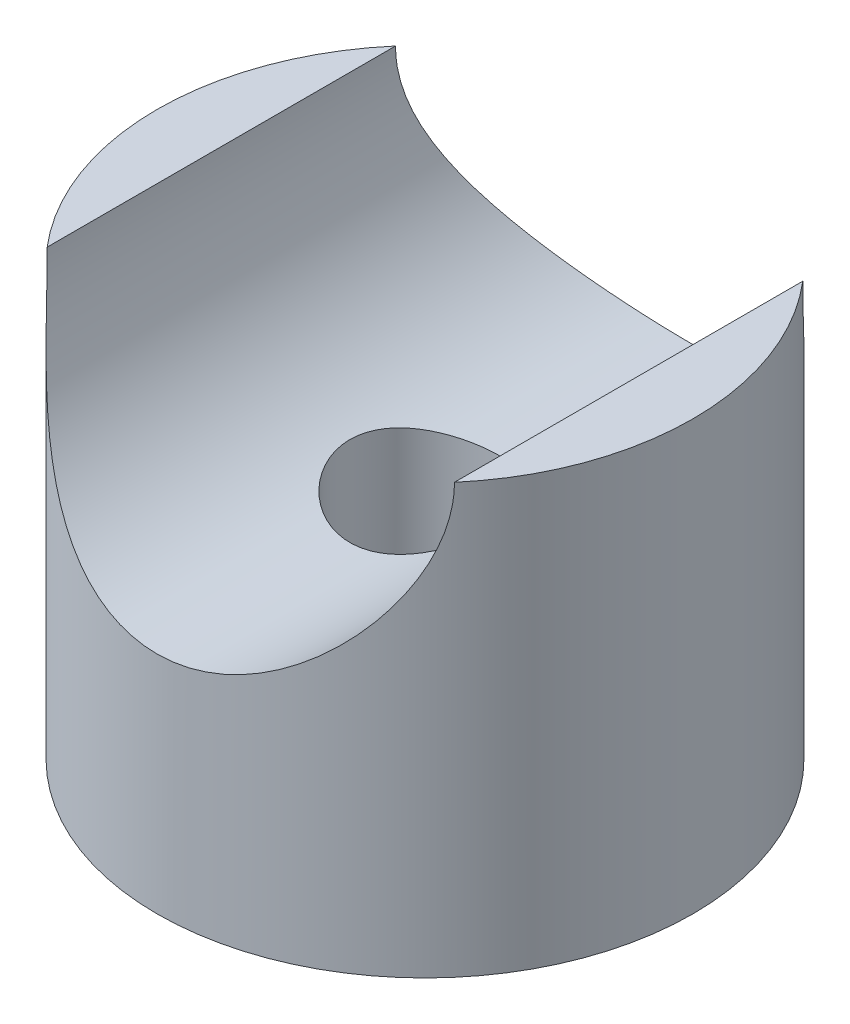
ISO-10303-21;
HEADER;
FILE_DESCRIPTION(('STEP AP214'),'2;1');
FILE_NAME('part.step','',(''),(''),'','','');
FILE_SCHEMA(('AUTOMOTIVE_DESIGN { 1 0 10303 214 1 1 1 1 }'));
ENDSEC;
DATA;
#1=APPLICATION_CONTEXT('core data for automotive mechanical design processes');
#2=APPLICATION_PROTOCOL_DEFINITION('international standard','automotive_design',2000,#1);
#3=PRODUCT_CONTEXT('',#1,'mechanical');
#4=PRODUCT('Part','Part','',(#3));
#5=PRODUCT_RELATED_PRODUCT_CATEGORY('part','',(#4));
#6=PRODUCT_DEFINITION_FORMATION('','',#4);
#7=PRODUCT_DEFINITION_CONTEXT('part definition',#1,'design');
#8=PRODUCT_DEFINITION('design','',#6,#7);
#9=PRODUCT_DEFINITION_SHAPE('','',#8);
#10=(LENGTH_UNIT() NAMED_UNIT(*) SI_UNIT(.MILLI.,.METRE.));
#11=(NAMED_UNIT(*) PLANE_ANGLE_UNIT() SI_UNIT($,.RADIAN.));
#12=(NAMED_UNIT(*) SI_UNIT($,.STERADIAN.) SOLID_ANGLE_UNIT());
#13=UNCERTAINTY_MEASURE_WITH_UNIT(LENGTH_MEASURE(1.E-05),#10,'distance_accuracy_value','');
#14=(GEOMETRIC_REPRESENTATION_CONTEXT(3) GLOBAL_UNCERTAINTY_ASSIGNED_CONTEXT((#13)) GLOBAL_UNIT_ASSIGNED_CONTEXT((#10,
#11,#12)) REPRESENTATION_CONTEXT('',''));
#15=CARTESIAN_POINT('',(0.,0.,0.));
#16=DIRECTION('',(0.,0.,1.));
#17=DIRECTION('',(1.,0.,0.));
#18=AXIS2_PLACEMENT_3D('',#15,#16,#17);
#19=CARTESIAN_POINT('',(0.,20.,0.));
#20=DIRECTION('',(0.,1.,0.));
#21=DIRECTION('',(0.,0.,1.));
#22=AXIS2_PLACEMENT_3D('',#19,#20,#21);
#23=PLANE('',#22);
#24=CARTESIAN_POINT('',(0.,20.,0.));
#25=DIRECTION('',(0.,1.,0.));
#26=DIRECTION('',(0.,0.,1.));
#27=AXIS2_PLACEMENT_3D('',#24,#25,#26);
#28=CIRCLE('',#27,12.5);
#29=CARTESIAN_POINT('',(9.5,20.,8.12403840463596));
#30=VERTEX_POINT('',#29);
#31=CARTESIAN_POINT('',(9.5,20.,-8.12403840463596));
#32=VERTEX_POINT('',#31);
#33=EDGE_CURVE('E11',#30,#32,#28,.T.);
#34=ORIENTED_EDGE('',*,*,#33,.T.);
#35=DIRECTION('',(0.,0.,-1.));
#36=VECTOR('',#35,1.);
#37=CARTESIAN_POINT('',(9.5,20.,22.));
#38=LINE('',#37,#36);
#39=EDGE_CURVE('E64',#32,#30,#38,.F.);
#40=ORIENTED_EDGE('',*,*,#39,.T.);
#41=EDGE_LOOP('',(#34,#40));
#42=FACE_BOUND('',#41,.T.);
#43=ADVANCED_FACE('F39',(#42),#23,.T.);
#44=CARTESIAN_POINT('',(-9.5,20.,-8.12403840463596));
#45=VERTEX_POINT('',#44);
#46=CARTESIAN_POINT('',(-9.5,20.,8.12403840463596));
#47=VERTEX_POINT('',#46);
#48=EDGE_CURVE('E53',#45,#47,#28,.T.);
#49=ORIENTED_EDGE('',*,*,#48,.T.);
#50=DIRECTION('',(0.,0.,-1.));
#51=VECTOR('',#50,1.);
#52=CARTESIAN_POINT('',(-9.5,20.,22.));
#53=LINE('',#52,#51);
#54=EDGE_CURVE('E74',#47,#45,#53,.T.);
#55=ORIENTED_EDGE('',*,*,#54,.T.);
#56=EDGE_LOOP('',(#49,#55));
#57=FACE_BOUND('',#56,.T.);
#58=ADVANCED_FACE('F82',(#57),#23,.T.);
#59=CARTESIAN_POINT('',(0.,20.,0.));
#60=DIRECTION('',(0.,-1.,0.));
#61=DIRECTION('',(0.,0.,-1.));
#62=AXIS2_PLACEMENT_3D('',#59,#60,#61);
#63=CYLINDRICAL_SURFACE('',#62,12.5);
#64=CARTESIAN_POINT('',(0.,0.,0.));
#65=DIRECTION('',(0.,1.,0.));
#66=DIRECTION('',(0.,0.,1.));
#67=AXIS2_PLACEMENT_3D('',#64,#65,#66);
#68=CIRCLE('',#67,12.5);
#69=CARTESIAN_POINT('',(0.,0.,12.5));
#70=VERTEX_POINT('',#69);
#71=EDGE_CURVE('E83',#70,#70,#68,.T.);
#72=ORIENTED_EDGE('',*,*,#71,.T.);
#73=EDGE_LOOP('',(#72));
#74=FACE_BOUND('',#73,.T.);
#75=CARTESIAN_POINT('',(-9.5,20.,8.12403840463596));
#76=CARTESIAN_POINT('',(-9.50000274311843,19.8886300570297,8.12402973250241));
#77=CARTESIAN_POINT('',(-9.49804091295763,19.7772826773266,8.12632986945214));
#78=CARTESIAN_POINT('',(-9.49022022968377,19.5549308435585,8.1354639676329));
#79=CARTESIAN_POINT('',(-9.48436208330054,19.4439263309706,8.14229710664883));
#80=CARTESIAN_POINT('',(-9.46103081893254,19.1123893025562,8.16942449957605));
#81=CARTESIAN_POINT('',(-9.43780050702786,18.8927507458728,8.19634761223029));
#82=CARTESIAN_POINT('',(-9.37705660977574,18.4612788235135,8.26576504344153));
#83=CARTESIAN_POINT('',(-9.33974781483549,18.2493792043068,8.30803579145839));
#84=CARTESIAN_POINT('',(-9.25165735130008,17.8314813522188,8.40601978871379));
#85=CARTESIAN_POINT('',(-9.20086720627091,17.6254869228445,8.46174149327323));
#86=CARTESIAN_POINT('',(-9.07445549509806,17.1769537353766,8.59735857481399));
#87=CARTESIAN_POINT('',(-8.99584440118128,16.9360550148814,8.67987543983865));
#88=CARTESIAN_POINT('',(-8.8214755089005,16.4652245601162,8.85703167883857));
#89=CARTESIAN_POINT('',(-8.72571426508189,16.2352950413283,8.95167348761808));
#90=CARTESIAN_POINT('',(-8.51755951872615,15.7853872470806,9.14997035642966));
#91=CARTESIAN_POINT('',(-8.40507579029559,15.5654719802833,9.25367296784296));
#92=CARTESIAN_POINT('',(-8.16467650812219,15.1370386397966,9.46645814209731));
#93=CARTESIAN_POINT('',(-8.03676202295207,14.9285197783629,9.57554033209612));
#94=CARTESIAN_POINT('',(-7.7630514049336,14.5184747675588,9.79882186332866));
#95=CARTESIAN_POINT('',(-7.6169248087193,14.3172020347856,9.91308095888356));
#96=CARTESIAN_POINT('',(-7.30945957890885,13.9268186732286,10.1419196424029));
#97=CARTESIAN_POINT('',(-7.14812052829152,13.7377083780946,10.2564992390697));
#98=CARTESIAN_POINT('',(-6.81082794722964,13.3724600585471,10.4835045605759));
#99=CARTESIAN_POINT('',(-6.63490463772777,13.1962965687153,10.5959341732868));
#100=CARTESIAN_POINT('',(-6.26832404086982,12.8571379160848,10.8168351402387));
#101=CARTESIAN_POINT('',(-6.07766193851501,12.6941470925226,10.9253051837498));
#102=CARTESIAN_POINT('',(-5.69018498924475,12.3888193825074,11.1318448048814));
#103=CARTESIAN_POINT('',(-5.49395649728446,12.2459052132413,11.2301593559457));
#104=CARTESIAN_POINT('',(-5.0887610607027,11.974168009017,11.4194783697716));
#105=CARTESIAN_POINT('',(-4.87980041700756,11.8453380908025,11.5104863975489));
#106=CARTESIAN_POINT('',(-4.44955681155557,11.6028313846377,11.6835450269374));
#107=CARTESIAN_POINT('',(-4.22826853109066,11.4891612102128,11.7655917163059));
#108=CARTESIAN_POINT('',(-3.77434727376476,11.2783653666191,11.9189631724844));
#109=CARTESIAN_POINT('',(-3.54171438745961,11.1812395654162,11.9902880248606));
#110=CARTESIAN_POINT('',(-3.06417116692747,11.0040956536297,12.1211673632536));
#111=CARTESIAN_POINT('',(-2.81916731468969,10.9242437589568,12.1806071064541));
#112=CARTESIAN_POINT('',(-2.32063082407474,10.7841604907409,12.2853381050529));
#113=CARTESIAN_POINT('',(-2.06709806000298,10.7239294064991,12.3306291518337));
#114=CARTESIAN_POINT('',(-1.55398749176044,10.6243216267745,12.4057355673124));
#115=CARTESIAN_POINT('',(-1.29441653093431,10.584922419146,12.4355676411837));
#116=CARTESIAN_POINT('',(-0.771571139065848,10.5277353919667,12.4789200108215));
#117=CARTESIAN_POINT('',(-0.50829739116411,10.5099436375425,12.4924432765366));
#118=CARTESIAN_POINT('',(-0.0214108900279506,10.4973989161627,12.5019767599162));
#119=CARTESIAN_POINT('',(0.202083514714957,10.4995274333723,12.500357561664));
#120=CARTESIAN_POINT('',(0.647961513731043,10.5194972636889,12.4851867280044));
#121=CARTESIAN_POINT('',(0.870345151876429,10.5373379511936,12.4716355676851));
#122=CARTESIAN_POINT('',(1.31228767264574,10.588443814415,12.4329044595135));
#123=CARTESIAN_POINT('',(1.53184665915875,10.6217084211723,12.4077249406099));
#124=CARTESIAN_POINT('',(1.96659812383299,10.7031507734524,12.3462824945646));
#125=CARTESIAN_POINT('',(2.18179048467794,10.7513289190872,12.3100192700612));
#126=CARTESIAN_POINT('',(2.59969741926878,10.8601577866575,12.2284692675171));
#127=CARTESIAN_POINT('',(2.80259129470675,10.9203647207497,12.1835049718898));
#128=CARTESIAN_POINT('',(3.20202564336948,11.0534161683536,12.0846753355438));
#129=CARTESIAN_POINT('',(3.39856405265207,11.1262647393074,12.0308071373052));
#130=CARTESIAN_POINT('',(3.78432828644698,11.2837933148287,11.9150914185243));
#131=CARTESIAN_POINT('',(3.97355617084335,11.3684699551047,11.8532461672997));
#132=CARTESIAN_POINT('',(4.34417810144068,11.548927884041,11.7224891677027));
#133=CARTESIAN_POINT('',(4.52556931045861,11.6447131489765,11.6535748900345));
#134=CARTESIAN_POINT('',(4.90332033534793,11.8599311011771,11.5001866415938));
#135=CARTESIAN_POINT('',(5.09850581779219,11.9808167937332,11.4148587293952));
#136=CARTESIAN_POINT('',(5.47767750618184,12.2348762432617,11.2378308747473));
#137=CARTESIAN_POINT('',(5.66166204346253,12.3680518237258,11.1461299872186));
#138=CARTESIAN_POINT('',(6.01828549252876,12.6459938964851,10.9576892677936));
#139=CARTESIAN_POINT('',(6.19091173201522,12.7907729483034,10.8609440165777));
#140=CARTESIAN_POINT('',(6.52432917270586,13.0910597224804,10.6639868482345));
#141=CARTESIAN_POINT('',(6.6851234355656,13.2465646490792,10.5637758378469));
#142=CARTESIAN_POINT('',(7.02641580338636,13.6006495683767,10.3406522330836));
#143=CARTESIAN_POINT('',(7.20422768780278,13.8015390757268,10.2172845222994));
#144=CARTESIAN_POINT('',(7.54225611222099,14.2175921934341,9.97036555253643));
#145=CARTESIAN_POINT('',(7.70246828671849,14.4327593241373,9.84681425568827));
#146=CARTESIAN_POINT('',(8.00486771787172,14.877077176184,9.60259693431026));
#147=CARTESIAN_POINT('',(8.14704981082693,15.1062318757683,9.48193174433506));
#148=CARTESIAN_POINT('',(8.41261148515566,15.578317636569,9.24712636887976));
#149=CARTESIAN_POINT('',(8.53599831156128,15.8212433396611,9.13298367982003));
#150=CARTESIAN_POINT('',(8.72997805545987,16.24828310395,8.94706383877389));
#151=CARTESIAN_POINT('',(8.80549970448397,16.4290020857464,8.87260600909018));
#152=CARTESIAN_POINT('',(8.9460438862266,16.7973209108525,8.73087944558635));
#153=CARTESIAN_POINT('',(9.01106375219991,16.984922487083,8.66361253923791));
#154=CARTESIAN_POINT('',(9.12968068925038,17.3658836086356,8.53852079275913));
#155=CARTESIAN_POINT('',(9.18332289168828,17.5592168000997,8.4806588682495));
#156=CARTESIAN_POINT('',(9.27874395633497,17.9516755198605,8.37615244635763));
#157=CARTESIAN_POINT('',(9.32053098025425,18.1507969586049,8.32950023503934));
#158=CARTESIAN_POINT('',(9.37959259341158,18.4861556792478,8.26283855707346));
#159=CARTESIAN_POINT('',(9.40038638235435,18.6210541567335,8.23914317195109));
#160=CARTESIAN_POINT('',(9.43622229720901,18.8925481566748,8.19807598062425));
#161=CARTESIAN_POINT('',(9.45126582023549,19.0291432585715,8.18070263843258));
#162=CARTESIAN_POINT('',(9.47551371966966,19.3044183883412,8.15260739127683));
#163=CARTESIAN_POINT('',(9.4846804510259,19.4431061453022,8.14192837775227));
#164=CARTESIAN_POINT('',(9.49693172911945,19.7211910819632,8.12762597874081));
#165=CARTESIAN_POINT('',(9.50001275466359,19.860588625613,8.12400667802326));
#166=CARTESIAN_POINT('',(9.5,20.,8.12403840463596));
#167=B_SPLINE_CURVE_WITH_KNOTS('',3,(#75,#76,#77,#78,#79,#80,#81,#82,#83,#84,#85,#86,#87,#88,
#89,#90,#91,#92,#93,#94,#95,#96,#97,#98,#99,#100,#101,#102,#103,#104,#105,#106,#107,#108,#109,
#110,#111,#112,#113,#114,#115,#116,#117,#118,#119,#120,#121,#122,#123,#124,#125,#126,#127,#128,
#129,#130,#131,#132,#133,#134,#135,#136,#137,#138,#139,#140,#141,#142,#143,#144,#145,#146,#147,
#148,#149,#150,#151,#152,#153,#154,#155,#156,#157,#158,#159,#160,#161,#162,#163,#164,#165,#166),
.UNSPECIFIED.,.F.,.F.,(4,2,2,2,2,2,2,2,2,2,2,2,2,2,2,2,2,2,2,2,2,2,2,2,2,2,2,2,2,2,2,2,2,2,2,2,
2,2,2,2,2,2,2,2,2,4),(0.,0.334025338390055,0.667990106409528,1.33418107436726,1.99103326031616,
2.64829942613267,3.44656111619992,4.24498335681715,5.04788129399271,5.8507236627422,
6.67116164265406,7.49162211989216,8.31042304390908,9.12949260075239,9.91447217839496,
10.6990663893952,11.4840017722281,12.2689308905102,13.0611064617795,13.8532937128335,
14.6446231211512,15.4358084010501,16.1054893117806,16.775143559423,17.444773106742,
18.1144206209593,18.7628405919965,19.4114690652367,20.0599134214917,20.7085906056592,
21.442688459012,22.1768954085738,22.9119080793108,23.6467298836072,24.5316822644503,
25.4168536592194,26.3022779916381,27.1873601501427,27.8155486395689,28.4438963965994,
29.0697030628904,29.6950778405795,30.1104337238951,30.5256886259363,30.9435776336551,
31.361708361469),.UNSPECIFIED.);
#168=EDGE_CURVE('E70',#47,#30,#167,.T.);
#169=ORIENTED_EDGE('',*,*,#168,.F.);
#170=ORIENTED_EDGE('',*,*,#48,.F.);
#171=CARTESIAN_POINT('',(9.5,20.,-8.12403840463596));
#172=CARTESIAN_POINT('',(9.50000274311843,19.8886300570297,-8.12402973250241));
#173=CARTESIAN_POINT('',(9.49804091295763,19.7772826773266,-8.12632986945214));
#174=CARTESIAN_POINT('',(9.49022022968377,19.5549308435585,-8.1354639676329));
#175=CARTESIAN_POINT('',(9.48436208330054,19.4439263309706,-8.14229710664883));
#176=CARTESIAN_POINT('',(9.46103081893254,19.1123893025562,-8.16942449957605));
#177=CARTESIAN_POINT('',(9.43780050702786,18.8927507458728,-8.19634761223029));
#178=CARTESIAN_POINT('',(9.37705660977574,18.4612788235135,-8.26576504344153));
#179=CARTESIAN_POINT('',(9.33974781483549,18.2493792043068,-8.30803579145839));
#180=CARTESIAN_POINT('',(9.25165735130008,17.8314813522188,-8.40601978871379));
#181=CARTESIAN_POINT('',(9.20086720627091,17.6254869228445,-8.46174149327323));
#182=CARTESIAN_POINT('',(9.07445549509806,17.1769537353766,-8.59735857481399));
#183=CARTESIAN_POINT('',(8.99584440118128,16.9360550148814,-8.67987543983865));
#184=CARTESIAN_POINT('',(8.8214755089005,16.4652245601162,-8.85703167883857));
#185=CARTESIAN_POINT('',(8.72571426508189,16.2352950413283,-8.95167348761808));
#186=CARTESIAN_POINT('',(8.51755951872615,15.7853872470806,-9.14997035642966));
#187=CARTESIAN_POINT('',(8.40507579029559,15.5654719802833,-9.25367296784296));
#188=CARTESIAN_POINT('',(8.16467650812219,15.1370386397966,-9.46645814209731));
#189=CARTESIAN_POINT('',(8.03676202295207,14.9285197783629,-9.57554033209612));
#190=CARTESIAN_POINT('',(7.7630514049336,14.5184747675588,-9.79882186332866));
#191=CARTESIAN_POINT('',(7.6169248087193,14.3172020347856,-9.91308095888356));
#192=CARTESIAN_POINT('',(7.30945957890885,13.9268186732286,-10.1419196424029));
#193=CARTESIAN_POINT('',(7.14812052829152,13.7377083780946,-10.2564992390697));
#194=CARTESIAN_POINT('',(6.81082794722964,13.3724600585471,-10.4835045605759));
#195=CARTESIAN_POINT('',(6.63490463772777,13.1962965687153,-10.5959341732868));
#196=CARTESIAN_POINT('',(6.26832404086982,12.8571379160848,-10.8168351402387));
#197=CARTESIAN_POINT('',(6.07766193851501,12.6941470925226,-10.9253051837498));
#198=CARTESIAN_POINT('',(5.69018498924475,12.3888193825074,-11.1318448048814));
#199=CARTESIAN_POINT('',(5.49395649728446,12.2459052132413,-11.2301593559457));
#200=CARTESIAN_POINT('',(5.0887610607027,11.974168009017,-11.4194783697716));
#201=CARTESIAN_POINT('',(4.87980041700756,11.8453380908025,-11.5104863975489));
#202=CARTESIAN_POINT('',(4.44955681155557,11.6028313846377,-11.6835450269374));
#203=CARTESIAN_POINT('',(4.22826853109066,11.4891612102128,-11.7655917163059));
#204=CARTESIAN_POINT('',(3.77434727376476,11.2783653666191,-11.9189631724844));
#205=CARTESIAN_POINT('',(3.54171438745961,11.1812395654162,-11.9902880248606));
#206=CARTESIAN_POINT('',(3.06417116692747,11.0040956536297,-12.1211673632536));
#207=CARTESIAN_POINT('',(2.81916731468969,10.9242437589568,-12.1806071064541));
#208=CARTESIAN_POINT('',(2.32063082407474,10.7841604907409,-12.2853381050529));
#209=CARTESIAN_POINT('',(2.06709806000298,10.7239294064991,-12.3306291518337));
#210=CARTESIAN_POINT('',(1.55398749176044,10.6243216267745,-12.4057355673124));
#211=CARTESIAN_POINT('',(1.29441653093431,10.584922419146,-12.4355676411837));
#212=CARTESIAN_POINT('',(0.771571139065848,10.5277353919667,-12.4789200108215));
#213=CARTESIAN_POINT('',(0.50829739116411,10.5099436375425,-12.4924432765366));
#214=CARTESIAN_POINT('',(0.0214108900279506,10.4973989161627,-12.5019767599162));
#215=CARTESIAN_POINT('',(-0.202083514714957,10.4995274333723,-12.500357561664));
#216=CARTESIAN_POINT('',(-0.647961513731043,10.5194972636889,-12.4851867280044));
#217=CARTESIAN_POINT('',(-0.870345151876429,10.5373379511936,-12.4716355676851));
#218=CARTESIAN_POINT('',(-1.31228767264574,10.588443814415,-12.4329044595135));
#219=CARTESIAN_POINT('',(-1.53184665915875,10.6217084211723,-12.4077249406099));
#220=CARTESIAN_POINT('',(-1.96659812383299,10.7031507734524,-12.3462824945646));
#221=CARTESIAN_POINT('',(-2.18179048467794,10.7513289190872,-12.3100192700612));
#222=CARTESIAN_POINT('',(-2.59969741926878,10.8601577866575,-12.2284692675171));
#223=CARTESIAN_POINT('',(-2.80259129470675,10.9203647207497,-12.1835049718898));
#224=CARTESIAN_POINT('',(-3.20202564336948,11.0534161683536,-12.0846753355438));
#225=CARTESIAN_POINT('',(-3.39856405265207,11.1262647393074,-12.0308071373052));
#226=CARTESIAN_POINT('',(-3.78432828644698,11.2837933148287,-11.9150914185243));
#227=CARTESIAN_POINT('',(-3.97355617084335,11.3684699551047,-11.8532461672997));
#228=CARTESIAN_POINT('',(-4.34417810144068,11.548927884041,-11.7224891677027));
#229=CARTESIAN_POINT('',(-4.52556931045861,11.6447131489765,-11.6535748900345));
#230=CARTESIAN_POINT('',(-4.90332033534793,11.8599311011771,-11.5001866415938));
#231=CARTESIAN_POINT('',(-5.09850581779219,11.9808167937332,-11.4148587293952));
#232=CARTESIAN_POINT('',(-5.47767750618184,12.2348762432617,-11.2378308747473));
#233=CARTESIAN_POINT('',(-5.66166204346253,12.3680518237258,-11.1461299872186));
#234=CARTESIAN_POINT('',(-6.01828549252876,12.6459938964851,-10.9576892677936));
#235=CARTESIAN_POINT('',(-6.19091173201522,12.7907729483034,-10.8609440165777));
#236=CARTESIAN_POINT('',(-6.52432917270586,13.0910597224804,-10.6639868482345));
#237=CARTESIAN_POINT('',(-6.6851234355656,13.2465646490792,-10.5637758378469));
#238=CARTESIAN_POINT('',(-7.02641580338636,13.6006495683767,-10.3406522330836));
#239=CARTESIAN_POINT('',(-7.20422768780278,13.8015390757268,-10.2172845222994));
#240=CARTESIAN_POINT('',(-7.54225611222099,14.2175921934341,-9.97036555253643));
#241=CARTESIAN_POINT('',(-7.70246828671849,14.4327593241373,-9.84681425568827));
#242=CARTESIAN_POINT('',(-8.00486771787172,14.877077176184,-9.60259693431026));
#243=CARTESIAN_POINT('',(-8.14704981082693,15.1062318757683,-9.48193174433506));
#244=CARTESIAN_POINT('',(-8.41261148515566,15.578317636569,-9.24712636887976));
#245=CARTESIAN_POINT('',(-8.53599831156128,15.8212433396611,-9.13298367982003));
#246=CARTESIAN_POINT('',(-8.72997805545987,16.24828310395,-8.94706383877389));
#247=CARTESIAN_POINT('',(-8.80549970448397,16.4290020857464,-8.87260600909018));
#248=CARTESIAN_POINT('',(-8.9460438862266,16.7973209108525,-8.73087944558635));
#249=CARTESIAN_POINT('',(-9.01106375219991,16.984922487083,-8.66361253923791));
#250=CARTESIAN_POINT('',(-9.12968068925038,17.3658836086356,-8.53852079275913));
#251=CARTESIAN_POINT('',(-9.18332289168828,17.5592168000997,-8.4806588682495));
#252=CARTESIAN_POINT('',(-9.27874395633497,17.9516755198605,-8.37615244635763));
#253=CARTESIAN_POINT('',(-9.32053098025425,18.1507969586049,-8.32950023503934));
#254=CARTESIAN_POINT('',(-9.37959259341158,18.4861556792478,-8.26283855707346));
#255=CARTESIAN_POINT('',(-9.40038638235435,18.6210541567335,-8.23914317195109));
#256=CARTESIAN_POINT('',(-9.43622229720901,18.8925481566748,-8.19807598062425));
#257=CARTESIAN_POINT('',(-9.45126582023549,19.0291432585715,-8.18070263843258));
#258=CARTESIAN_POINT('',(-9.47551371966966,19.3044183883412,-8.15260739127683));
#259=CARTESIAN_POINT('',(-9.4846804510259,19.4431061453022,-8.14192837775227));
#260=CARTESIAN_POINT('',(-9.49693172911945,19.7211910819632,-8.12762597874081));
#261=CARTESIAN_POINT('',(-9.50001275466359,19.860588625613,-8.12400667802326));
#262=CARTESIAN_POINT('',(-9.5,20.,-8.12403840463596));
#263=B_SPLINE_CURVE_WITH_KNOTS('',3,(#171,#172,#173,#174,#175,#176,#177,#178,#179,#180,#181,
#182,#183,#184,#185,#186,#187,#188,#189,#190,#191,#192,#193,#194,#195,#196,#197,#198,#199,#200,
#201,#202,#203,#204,#205,#206,#207,#208,#209,#210,#211,#212,#213,#214,#215,#216,#217,#218,#219,
#220,#221,#222,#223,#224,#225,#226,#227,#228,#229,#230,#231,#232,#233,#234,#235,#236,#237,#238,
#239,#240,#241,#242,#243,#244,#245,#246,#247,#248,#249,#250,#251,#252,#253,#254,#255,#256,#257,
#258,#259,#260,#261,#262),.UNSPECIFIED.,.F.,.F.,(4,2,2,2,2,2,2,2,2,2,2,2,2,2,2,2,2,2,2,2,2,2,2,
2,2,2,2,2,2,2,2,2,2,2,2,2,2,2,2,2,2,2,2,2,2,4),(0.,0.334025338390055,0.667990106409528,
1.33418107436726,1.99103326031616,2.64829942613267,3.44656111619992,4.24498335681715,
5.04788129399271,5.8507236627422,6.67116164265406,7.49162211989216,8.31042304390908,
9.12949260075239,9.91447217839496,10.6990663893952,11.4840017722281,12.2689308905102,
13.0611064617795,13.8532937128335,14.6446231211512,15.4358084010501,16.1054893117806,
16.775143559423,17.444773106742,18.1144206209593,18.7628405919965,19.4114690652367,
20.0599134214917,20.7085906056592,21.442688459012,22.1768954085738,22.9119080793108,
23.6467298836072,24.5316822644503,25.4168536592194,26.3022779916381,27.1873601501427,
27.8155486395689,28.4438963965994,29.0697030628904,29.6950778405795,30.1104337238951,
30.5256886259363,30.9435776336551,31.361708361469),.UNSPECIFIED.);
#264=EDGE_CURVE('E72',#32,#45,#263,.T.);
#265=ORIENTED_EDGE('',*,*,#264,.F.);
#266=ORIENTED_EDGE('',*,*,#33,.F.);
#267=EDGE_LOOP('',(#169,#170,#265,#266));
#268=FACE_BOUND('',#267,.T.);
#269=ADVANCED_FACE('F41',(#74,#268),#63,.T.);
#270=CARTESIAN_POINT('',(0.,20.,0.));
#271=DIRECTION('',(0.,-1.,0.));
#272=DIRECTION('',(0.,0.,-1.));
#273=AXIS2_PLACEMENT_3D('',#270,#271,#272);
#274=CYLINDRICAL_SURFACE('',#273,3.5);
#275=CARTESIAN_POINT('',(0.,0.,0.));
#276=DIRECTION('',(0.,1.,0.));
#277=DIRECTION('',(0.,0.,1.));
#278=AXIS2_PLACEMENT_3D('',#275,#276,#277);
#279=CIRCLE('',#278,3.5);
#280=CARTESIAN_POINT('',(0.,0.,3.5));
#281=VERTEX_POINT('',#280);
#282=EDGE_CURVE('E81',#281,#281,#279,.T.);
#283=ORIENTED_EDGE('',*,*,#282,.F.);
#284=EDGE_LOOP('',(#283));
#285=FACE_BOUND('',#284,.T.);
#286=CARTESIAN_POINT('',(0.,10.5,-3.5));
#287=CARTESIAN_POINT('',(-0.189782501016907,10.4999958038041,-3.50000567673176));
#288=CARTESIAN_POINT('',(-0.379525465519282,10.5057369492587,-3.48451535043739));
#289=CARTESIAN_POINT('',(-0.753353777934343,10.5280672112201,-3.42320385504151));
#290=CARTESIAN_POINT('',(-0.937439719035304,10.5446551862504,-3.37738587749335));
#291=CARTESIAN_POINT('',(-1.2945095547621,10.5868948935147,-3.25725069775693));
#292=CARTESIAN_POINT('',(-1.46751368933484,10.6125295108333,-3.18298728764704));
#293=CARTESIAN_POINT('',(-1.79859902900946,10.6702990219044,-3.00833791156295));
#294=CARTESIAN_POINT('',(-1.95667636914745,10.7024355924618,-2.90794520512273));
#295=CARTESIAN_POINT('',(-2.25993516417948,10.7713607826248,-2.67956186020878));
#296=CARTESIAN_POINT('',(-2.40441940867956,10.8082778699715,-2.55068454371694));
#297=CARTESIAN_POINT('',(-2.67028099144139,10.8819592732281,-2.27087286625019));
#298=CARTESIAN_POINT('',(-2.79165160973059,10.9187235416784,-2.11993211310768));
#299=CARTESIAN_POINT('',(-3.01219773781402,10.9894177272643,-1.79355498441448));
#300=CARTESIAN_POINT('',(-3.11040143419667,11.0231952121008,-1.61742561122388));
#301=CARTESIAN_POINT('',(-3.27548448295336,11.0820999550098,-1.24970903558207));
#302=CARTESIAN_POINT('',(-3.34237585199901,11.1072305305074,-1.05812779620812));
#303=CARTESIAN_POINT('',(-3.44020525284718,11.1446260251582,-0.672958404983975));
#304=CARTESIAN_POINT('',(-3.47247028118448,11.1573639034407,-0.479754735360218));
#305=CARTESIAN_POINT('',(-3.50428049821036,11.1699184634685,-0.090287884232701));
#306=CARTESIAN_POINT('',(-3.50383860343316,11.1697402460058,0.105974058891239));
#307=CARTESIAN_POINT('',(-3.47126475055506,11.1568916620539,0.48398801512988));
#308=CARTESIAN_POINT('',(-3.44095464788778,11.144939480003,0.665925910631393));
#309=CARTESIAN_POINT('',(-3.35251002768895,11.1110801972278,1.02192411374398));
#310=CARTESIAN_POINT('',(-3.29437146759006,11.0891716501919,1.19598327280928));
#311=CARTESIAN_POINT('',(-3.15088915412677,11.0374230734239,1.53506549926057));
#312=CARTESIAN_POINT('',(-3.06506205338442,11.0074438238936,1.69986185856708));
#313=CARTESIAN_POINT('',(-2.86897555392001,10.9429800685785,2.01324973298194));
#314=CARTESIAN_POINT('',(-2.75870793008588,10.908494047711,2.16183576755551));
#315=CARTESIAN_POINT('',(-2.50846742755721,10.8361799900709,2.44869615783488));
#316=CARTESIAN_POINT('',(-2.36703436130135,10.7982800754107,2.5856816446701));
#317=CARTESIAN_POINT('',(-2.06276098627608,10.7253319342149,2.83436569639828));
#318=CARTESIAN_POINT('',(-1.89991761761246,10.6902841164534,2.94606064062215));
#319=CARTESIAN_POINT('',(-1.55425080945075,10.6263348847924,3.14234867474262));
#320=CARTESIAN_POINT('',(-1.37117248249021,10.5975296877342,3.22652646805256));
#321=CARTESIAN_POINT('',(-0.992129236289007,10.5500220611343,3.36246473105117));
#322=CARTESIAN_POINT('',(-0.796169873072212,10.5313153074567,3.41423907735591));
#323=CARTESIAN_POINT('',(-0.407785098049791,10.5068652382061,3.48145525966205));
#324=CARTESIAN_POINT('',(-0.215698885603693,10.5005029508469,3.49863362516764));
#325=CARTESIAN_POINT('',(0.168693825123767,10.4995551930418,3.50120855391341));
#326=CARTESIAN_POINT('',(0.361000267879163,10.5049672186978,3.48661187436037));
#327=CARTESIAN_POINT('',(0.732962282027211,10.5265512649363,3.42738074782359));
#328=CARTESIAN_POINT('',(0.912822950033891,10.5423197931353,3.38387200287894));
#329=CARTESIAN_POINT('',(1.26257444353581,10.5826266654736,3.2695215811399));
#330=CARTESIAN_POINT('',(1.43246396841084,10.6071661507362,3.19867634770539));
#331=CARTESIAN_POINT('',(1.76296255146319,10.6634645710136,3.02942753106686));
#332=CARTESIAN_POINT('',(1.92316001481877,10.6954121063717,2.93028484627077));
#333=CARTESIAN_POINT('',(2.22517268023633,10.7629769636032,2.70809576071882));
#334=CARTESIAN_POINT('',(2.36698123687887,10.798595603848,2.58504075839893));
#335=CARTESIAN_POINT('',(2.63648468203052,10.8720457487056,2.31040992394644));
#336=CARTESIAN_POINT('',(2.76294570230384,10.9098895452108,2.15762342009612));
#337=CARTESIAN_POINT('',(2.98866258261646,10.9815764957924,1.83223900063951));
#338=CARTESIAN_POINT('',(3.08791644158605,11.0154193554982,1.65963962913306));
#339=CARTESIAN_POINT('',(3.25638938753798,11.0750919895808,1.29836371061516));
#340=CARTESIAN_POINT('',(3.32551955782824,11.1008979782567,1.10964150836264));
#341=CARTESIAN_POINT('',(3.43058856017998,11.1408644114567,0.72202526216965));
#342=CARTESIAN_POINT('',(3.46654695895906,11.1550317206375,0.523137287787687));
#343=CARTESIAN_POINT('',(3.50253657862739,11.1692256410343,0.134152212577613));
#344=CARTESIAN_POINT('',(3.50466237207741,11.1700766067043,-0.0557227119075935));
#345=CARTESIAN_POINT('',(3.47825811563849,11.1596426523755,-0.43297091780879));
#346=CARTESIAN_POINT('',(3.44973076846231,11.1483588023134,-0.620344418302758));
#347=CARTESIAN_POINT('',(3.36443857794893,11.1156016028718,-0.981880038512178));
#348=CARTESIAN_POINT('',(3.30849937731209,11.094426986223,-1.15626629262454));
#349=CARTESIAN_POINT('',(3.17068791273808,11.0444383336159,-1.49328689056117));
#350=CARTESIAN_POINT('',(3.08880920463654,11.0156223996117,-1.6559183017806));
#351=CARTESIAN_POINT('',(2.89658496161966,10.9517660596191,-1.97383959417803));
#352=CARTESIAN_POINT('',(2.78499900351247,10.9164828975991,-2.12833016993967));
#353=CARTESIAN_POINT('',(2.53847630436953,10.8445310934208,-2.41706427492377));
#354=CARTESIAN_POINT('',(2.40353227497615,10.8078620216205,-2.55130145999159));
#355=CARTESIAN_POINT('',(2.1058118573601,10.735001960735,-2.80275390939182));
#356=CARTESIAN_POINT('',(1.94196010841773,10.6989328177809,-2.91873673662692));
#357=CARTESIAN_POINT('',(1.59583241829018,10.6333403780039,-3.12146392543305));
#358=CARTESIAN_POINT('',(1.41355612176271,10.603817207464,-3.20820772294997));
#359=CARTESIAN_POINT('',(1.03012401507585,10.5539840482046,-3.35140042183531));
#360=CARTESIAN_POINT('',(0.828576938649612,10.5339622306308,-3.40691023718715));
#361=CARTESIAN_POINT('',(0.418001617055457,10.5069755037811,-3.48119849791931));
#362=CARTESIAN_POINT('',(0.208976839392466,10.5000046205933,-3.49999374913147));
#363=CARTESIAN_POINT('',(0.,10.5,-3.5));
#364=B_SPLINE_CURVE_WITH_KNOTS('',3,(#286,#287,#288,#289,#290,#291,#292,#293,#294,#295,#296,
#297,#298,#299,#300,#301,#302,#303,#304,#305,#306,#307,#308,#309,#310,#311,#312,#313,#314,#315,
#316,#317,#318,#319,#320,#321,#322,#323,#324,#325,#326,#327,#328,#329,#330,#331,#332,#333,#334,
#335,#336,#337,#338,#339,#340,#341,#342,#343,#344,#345,#346,#347,#348,#349,#350,#351,#352,#353,
#354,#355,#356,#357,#358,#359,#360,#361,#362,#363),.UNSPECIFIED.,.T.,.F.,(4,2,2,2,2,2,2,2,2,2,2,
2,2,2,2,2,2,2,2,2,2,2,2,2,2,2,2,2,2,2,2,2,2,2,2,2,2,2,4),(0.,0.56857697028979,1.13709411546253,
1.70454142530672,2.27213526251212,2.86081433921137,3.44966430592823,4.06000721954733,
4.67011571062265,5.2559017937606,5.84145654099497,6.39337480556043,6.94537327019459,
7.50758258773469,8.06998139691606,8.66876186325863,9.26762799866449,9.87515471171535,
10.4824210761106,11.0583598586182,11.634176175296,12.1887923687307,12.7434807453824,
13.3142430286781,13.8852110037383,14.4881301716657,15.09109367203,15.6958250907704,
16.3001995738259,16.8670008054195,17.4337520657802,17.984394516221,18.535173870446,
19.1140862902652,19.6931796733056,20.3020921905906,20.9110164538181,21.5373852917727,
22.1634673465767),.UNSPECIFIED.);
#365=CARTESIAN_POINT('',(0.,10.5,-3.5));
#366=VERTEX_POINT('',#365);
#367=EDGE_CURVE('E42',#366,#366,#364,.T.);
#368=ORIENTED_EDGE('',*,*,#367,.T.);
#369=EDGE_LOOP('',(#368));
#370=FACE_BOUND('',#369,.T.);
#371=ADVANCED_FACE('F98',(#285,#370),#274,.F.);
#372=CARTESIAN_POINT('',(0.,0.,0.));
#373=DIRECTION('',(0.,1.,0.));
#374=DIRECTION('',(0.,0.,1.));
#375=AXIS2_PLACEMENT_3D('',#372,#373,#374);
#376=PLANE('',#375);
#377=ORIENTED_EDGE('',*,*,#71,.F.);
#378=EDGE_LOOP('',(#377));
#379=FACE_BOUND('',#378,.T.);
#380=ORIENTED_EDGE('',*,*,#282,.T.);
#381=EDGE_LOOP('',(#380));
#382=FACE_BOUND('',#381,.T.);
#383=ADVANCED_FACE('F96',(#379,#382),#376,.F.);
#384=CARTESIAN_POINT('',(0.,20.,22.));
#385=DIRECTION('',(0.,0.,-1.));
#386=DIRECTION('',(-1.,0.,0.));
#387=AXIS2_PLACEMENT_3D('',#384,#385,#386);
#388=CYLINDRICAL_SURFACE('',#387,9.5);
#389=ORIENTED_EDGE('',*,*,#367,.F.);
#390=EDGE_LOOP('',(#389));
#391=FACE_BOUND('',#390,.T.);
#392=ORIENTED_EDGE('',*,*,#168,.T.);
#393=ORIENTED_EDGE('',*,*,#39,.F.);
#394=ORIENTED_EDGE('',*,*,#264,.T.);
#395=ORIENTED_EDGE('',*,*,#54,.F.);
#396=EDGE_LOOP('',(#392,#393,#394,#395));
#397=FACE_BOUND('',#396,.T.);
#398=ADVANCED_FACE('F71',(#391,#397),#388,.F.);
#399=CLOSED_SHELL('',(#43,#58,#269,#371,#383,#398));
#400=MANIFOLD_SOLID_BREP('B2',#399);
#401=ADVANCED_BREP_SHAPE_REPRESENTATION('',(#18,#400),#14);
#402=SHAPE_DEFINITION_REPRESENTATION(#9,#401);
ENDSEC;
END-ISO-10303-21;
